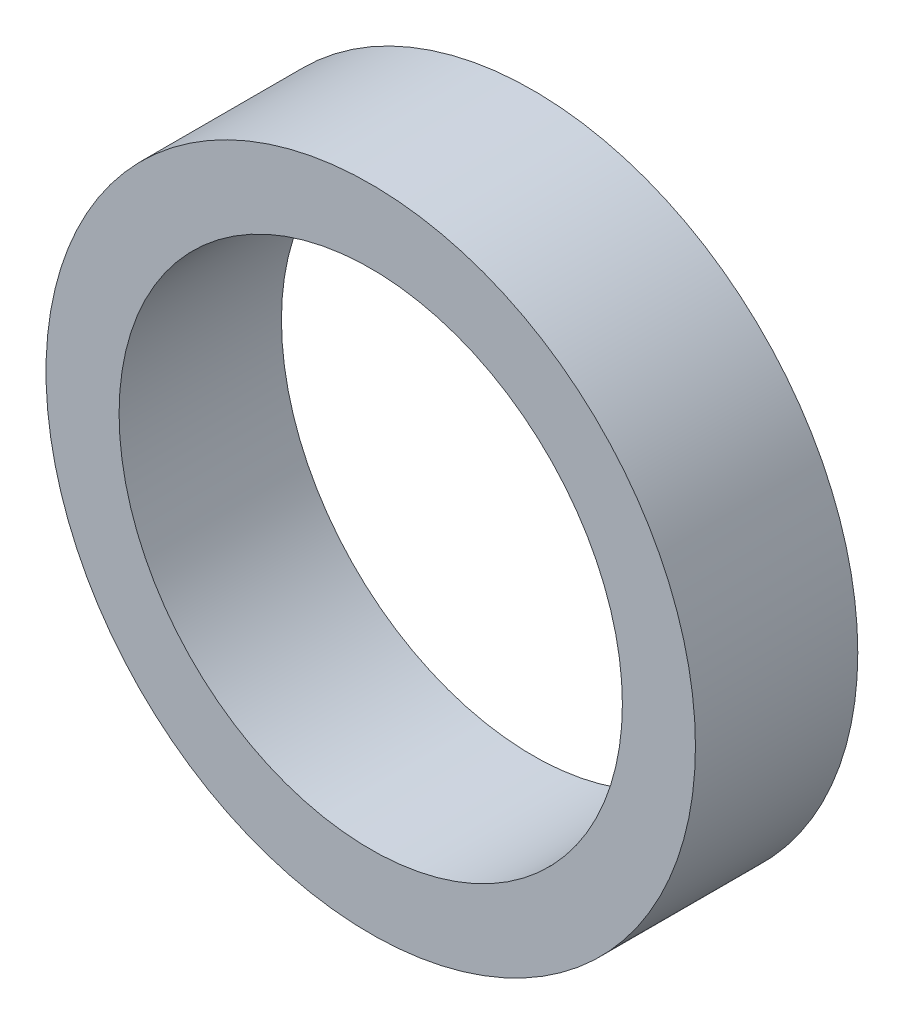
ISO-10303-21;
HEADER;
FILE_DESCRIPTION(('STEP AP214'),'2;1');
FILE_NAME('part.step','',(''),(''),'','','');
FILE_SCHEMA(('AUTOMOTIVE_DESIGN { 1 0 10303 214 1 1 1 1 }'));
ENDSEC;
DATA;
#1=APPLICATION_CONTEXT('core data for automotive mechanical design processes');
#2=APPLICATION_PROTOCOL_DEFINITION('international standard','automotive_design',2000,#1);
#3=PRODUCT_CONTEXT('',#1,'mechanical');
#4=PRODUCT('Part','Part','',(#3));
#5=PRODUCT_RELATED_PRODUCT_CATEGORY('part','',(#4));
#6=PRODUCT_DEFINITION_FORMATION('','',#4);
#7=PRODUCT_DEFINITION_CONTEXT('part definition',#1,'design');
#8=PRODUCT_DEFINITION('design','',#6,#7);
#9=PRODUCT_DEFINITION_SHAPE('','',#8);
#10=(LENGTH_UNIT() NAMED_UNIT(*) SI_UNIT(.MILLI.,.METRE.));
#11=(NAMED_UNIT(*) PLANE_ANGLE_UNIT() SI_UNIT($,.RADIAN.));
#12=(NAMED_UNIT(*) SI_UNIT($,.STERADIAN.) SOLID_ANGLE_UNIT());
#13=UNCERTAINTY_MEASURE_WITH_UNIT(LENGTH_MEASURE(1.E-05),#10,'distance_accuracy_value','');
#14=(GEOMETRIC_REPRESENTATION_CONTEXT(3) GLOBAL_UNCERTAINTY_ASSIGNED_CONTEXT((#13)) GLOBAL_UNIT_ASSIGNED_CONTEXT((#10,
#11,#12)) REPRESENTATION_CONTEXT('',''));
#15=CARTESIAN_POINT('',(0.,0.,0.));
#16=DIRECTION('',(0.,0.,1.));
#17=DIRECTION('',(1.,0.,0.));
#18=AXIS2_PLACEMENT_3D('',#15,#16,#17);
#19=CARTESIAN_POINT('',(0.,0.,1.));
#20=DIRECTION('',(0.,0.,1.));
#21=DIRECTION('',(1.,0.,0.));
#22=AXIS2_PLACEMENT_3D('',#19,#20,#21);
#23=PLANE('',#22);
#24=CARTESIAN_POINT('',(0.,0.,1.));
#25=DIRECTION('',(0.,0.,1.));
#26=DIRECTION('',(1.,0.,0.));
#27=AXIS2_PLACEMENT_3D('',#24,#25,#26);
#28=CIRCLE('',#27,2.);
#29=CARTESIAN_POINT('',(2.,0.,1.));
#30=VERTEX_POINT('',#29);
#31=EDGE_CURVE('E10',#30,#30,#28,.T.);
#32=ORIENTED_EDGE('',*,*,#31,.T.);
#33=EDGE_LOOP('',(#32));
#34=FACE_BOUND('',#33,.T.);
#35=CARTESIAN_POINT('',(0.,0.,1.));
#36=DIRECTION('',(0.,0.,1.));
#37=DIRECTION('',(1.,0.,0.));
#38=AXIS2_PLACEMENT_3D('',#35,#36,#37);
#39=CIRCLE('',#38,1.55);
#40=CARTESIAN_POINT('',(1.55,0.,1.));
#41=VERTEX_POINT('',#40);
#42=EDGE_CURVE('E56',#41,#41,#39,.T.);
#43=ORIENTED_EDGE('',*,*,#42,.F.);
#44=EDGE_LOOP('',(#43));
#45=FACE_BOUND('',#44,.T.);
#46=ADVANCED_FACE('F43',(#34,#45),#23,.T.);
#47=CARTESIAN_POINT('',(0.,0.,0.));
#48=DIRECTION('',(0.,0.,1.));
#49=DIRECTION('',(1.,0.,0.));
#50=AXIS2_PLACEMENT_3D('',#47,#48,#49);
#51=PLANE('',#50);
#52=CARTESIAN_POINT('',(0.,0.,0.));
#53=DIRECTION('',(0.,0.,1.));
#54=DIRECTION('',(1.,0.,0.));
#55=AXIS2_PLACEMENT_3D('',#52,#53,#54);
#56=CIRCLE('',#55,2.);
#57=CARTESIAN_POINT('',(2.,0.,0.));
#58=VERTEX_POINT('',#57);
#59=EDGE_CURVE('E47',#58,#58,#56,.T.);
#60=ORIENTED_EDGE('',*,*,#59,.F.);
#61=EDGE_LOOP('',(#60));
#62=FACE_BOUND('',#61,.T.);
#63=CARTESIAN_POINT('',(0.,0.,0.));
#64=DIRECTION('',(0.,0.,1.));
#65=DIRECTION('',(1.,0.,0.));
#66=AXIS2_PLACEMENT_3D('',#63,#64,#65);
#67=CIRCLE('',#66,1.55);
#68=CARTESIAN_POINT('',(1.55,0.,0.));
#69=VERTEX_POINT('',#68);
#70=EDGE_CURVE('E58',#69,#69,#67,.T.);
#71=ORIENTED_EDGE('',*,*,#70,.T.);
#72=EDGE_LOOP('',(#71));
#73=FACE_BOUND('',#72,.T.);
#74=ADVANCED_FACE('F70',(#62,#73),#51,.F.);
#75=CARTESIAN_POINT('',(0.,0.,1.));
#76=DIRECTION('',(0.,0.,-1.));
#77=DIRECTION('',(-1.,0.,0.));
#78=AXIS2_PLACEMENT_3D('',#75,#76,#77);
#79=CYLINDRICAL_SURFACE('',#78,2.);
#80=ORIENTED_EDGE('',*,*,#31,.F.);
#81=EDGE_LOOP('',(#80));
#82=FACE_BOUND('',#81,.T.);
#83=ORIENTED_EDGE('',*,*,#59,.T.);
#84=EDGE_LOOP('',(#83));
#85=FACE_BOUND('',#84,.T.);
#86=ADVANCED_FACE('F45',(#82,#85),#79,.T.);
#87=CARTESIAN_POINT('',(0.,0.,1.));
#88=DIRECTION('',(0.,0.,-1.));
#89=DIRECTION('',(-1.,0.,0.));
#90=AXIS2_PLACEMENT_3D('',#87,#88,#89);
#91=CYLINDRICAL_SURFACE('',#90,1.55);
#92=ORIENTED_EDGE('',*,*,#42,.T.);
#93=EDGE_LOOP('',(#92));
#94=FACE_BOUND('',#93,.T.);
#95=ORIENTED_EDGE('',*,*,#70,.F.);
#96=EDGE_LOOP('',(#95));
#97=FACE_BOUND('',#96,.T.);
#98=ADVANCED_FACE('F66',(#94,#97),#91,.F.);
#99=CLOSED_SHELL('',(#46,#74,#86,#98));
#100=MANIFOLD_SOLID_BREP('B2',#99);
#101=ADVANCED_BREP_SHAPE_REPRESENTATION('',(#18,#100),#14);
#102=SHAPE_DEFINITION_REPRESENTATION(#9,#101);
ENDSEC;
END-ISO-10303-21;
